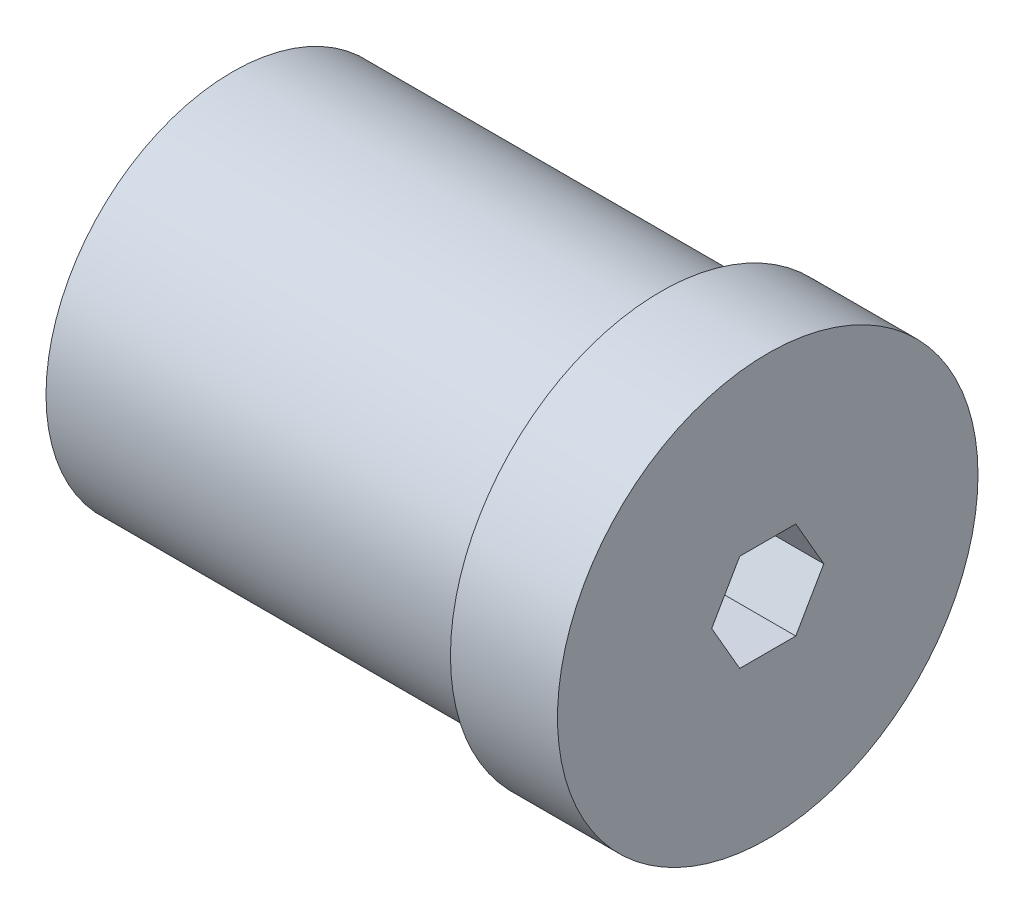
ISO-10303-21;
HEADER;
FILE_DESCRIPTION(('STEP AP214'),'2;1');
FILE_NAME('part.step','',(''),(''),'','','');
FILE_SCHEMA(('AUTOMOTIVE_DESIGN { 1 0 10303 214 1 1 1 1 }'));
ENDSEC;
DATA;
#1=APPLICATION_CONTEXT('core data for automotive mechanical design processes');
#2=APPLICATION_PROTOCOL_DEFINITION('international standard','automotive_design',2000,#1);
#3=PRODUCT_CONTEXT('',#1,'mechanical');
#4=PRODUCT('Part','Part','',(#3));
#5=PRODUCT_RELATED_PRODUCT_CATEGORY('part','',(#4));
#6=PRODUCT_DEFINITION_FORMATION('','',#4);
#7=PRODUCT_DEFINITION_CONTEXT('part definition',#1,'design');
#8=PRODUCT_DEFINITION('design','',#6,#7);
#9=PRODUCT_DEFINITION_SHAPE('','',#8);
#10=(LENGTH_UNIT() NAMED_UNIT(*) SI_UNIT(.MILLI.,.METRE.));
#11=(NAMED_UNIT(*) PLANE_ANGLE_UNIT() SI_UNIT($,.RADIAN.));
#12=(NAMED_UNIT(*) SI_UNIT($,.STERADIAN.) SOLID_ANGLE_UNIT());
#13=UNCERTAINTY_MEASURE_WITH_UNIT(LENGTH_MEASURE(1.E-05),#10,'distance_accuracy_value','');
#14=(GEOMETRIC_REPRESENTATION_CONTEXT(3) GLOBAL_UNCERTAINTY_ASSIGNED_CONTEXT((#13)) GLOBAL_UNIT_ASSIGNED_CONTEXT((#10,
#11,#12)) REPRESENTATION_CONTEXT('',''));
#15=CARTESIAN_POINT('',(0.,0.,0.));
#16=DIRECTION('',(0.,0.,1.));
#17=DIRECTION('',(1.,0.,0.));
#18=AXIS2_PLACEMENT_3D('',#15,#16,#17);
#19=CARTESIAN_POINT('',(66.,0.,0.));
#20=DIRECTION('',(1.,0.,0.));
#21=DIRECTION('',(0.,0.,-1.));
#22=AXIS2_PLACEMENT_3D('',#19,#20,#21);
#23=PLANE('',#22);
#24=CARTESIAN_POINT('',(66.,0.,0.));
#25=DIRECTION('',(1.,0.,0.));
#26=DIRECTION('',(0.,0.,-1.));
#27=AXIS2_PLACEMENT_3D('',#24,#25,#26);
#28=CIRCLE('',#27,24.4);
#29=CARTESIAN_POINT('',(66.,0.,-24.4));
#30=VERTEX_POINT('',#29);
#31=EDGE_CURVE('E11',#30,#30,#28,.T.);
#32=ORIENTED_EDGE('',*,*,#31,.T.);
#33=EDGE_LOOP('',(#32));
#34=FACE_BOUND('',#33,.T.);
#35=CARTESIAN_POINT('',(66.,0.,0.));
#36=DIRECTION('',(-1.,0.,0.));
#37=DIRECTION('',(0.,0.,1.));
#38=AXIS2_PLACEMENT_3D('',#35,#36,#37);
#39=CIRCLE('',#38,25.4);
#40=CARTESIAN_POINT('',(66.,0.,25.4));
#41=VERTEX_POINT('',#40);
#42=EDGE_CURVE('E285',#41,#41,#39,.T.);
#43=ORIENTED_EDGE('',*,*,#42,.T.);
#44=EDGE_LOOP('',(#43));
#45=FACE_BOUND('',#44,.T.);
#46=ADVANCED_FACE('F37',(#34,#45),#23,.F.);
#47=CARTESIAN_POINT('',(70.,0.,0.));
#48=DIRECTION('',(-1.,0.,0.));
#49=DIRECTION('',(0.,0.,1.));
#50=AXIS2_PLACEMENT_3D('',#47,#48,#49);
#51=CYLINDRICAL_SURFACE('',#50,24.4);
#52=CARTESIAN_POINT('',(0.,0.,0.));
#53=DIRECTION('',(1.,0.,0.));
#54=DIRECTION('',(0.,0.,-1.));
#55=AXIS2_PLACEMENT_3D('',#52,#53,#54);
#56=CIRCLE('',#55,24.4);
#57=CARTESIAN_POINT('',(0.,0.,-24.4));
#58=VERTEX_POINT('',#57);
#59=EDGE_CURVE('E45',#58,#58,#56,.T.);
#60=ORIENTED_EDGE('',*,*,#59,.T.);
#61=EDGE_LOOP('',(#60));
#62=FACE_BOUND('',#61,.T.);
#63=ORIENTED_EDGE('',*,*,#31,.F.);
#64=EDGE_LOOP('',(#63));
#65=FACE_BOUND('',#64,.T.);
#66=ADVANCED_FACE('F39',(#62,#65),#51,.T.);
#67=CARTESIAN_POINT('',(70.,0.,0.));
#68=DIRECTION('',(1.,0.,0.));
#69=DIRECTION('',(0.,0.,-1.));
#70=AXIS2_PLACEMENT_3D('',#67,#68,#69);
#71=PLANE('',#70);
#72=DIRECTION('',(0.,0.866025403784439,0.5));
#73=VECTOR('',#72,1.);
#74=CARTESIAN_POINT('',(70.,0.,-7.33234841870825));
#75=LINE('',#74,#73);
#76=CARTESIAN_POINT('',(70.,0.,-7.33234841870825));
#77=VERTEX_POINT('',#76);
#78=CARTESIAN_POINT('',(70.,6.35,-3.66617420935412));
#79=VERTEX_POINT('',#78);
#80=EDGE_CURVE('E98',#77,#79,#75,.T.);
#81=ORIENTED_EDGE('',*,*,#80,.F.);
#82=DIRECTION('',(0.,0.866025403784439,-0.5));
#83=VECTOR('',#82,1.);
#84=CARTESIAN_POINT('',(70.,-6.35,-3.66617420935412));
#85=LINE('',#84,#83);
#86=CARTESIAN_POINT('',(70.,-6.35,-3.66617420935412));
#87=VERTEX_POINT('',#86);
#88=EDGE_CURVE('E90',#87,#77,#85,.T.);
#89=ORIENTED_EDGE('',*,*,#88,.F.);
#90=DIRECTION('',(0.,0.,-1.));
#91=VECTOR('',#90,1.);
#92=CARTESIAN_POINT('',(70.,-6.35,3.66617420935413));
#93=LINE('',#92,#91);
#94=CARTESIAN_POINT('',(70.,-6.35,3.66617420935413));
#95=VERTEX_POINT('',#94);
#96=EDGE_CURVE('E121',#95,#87,#93,.T.);
#97=ORIENTED_EDGE('',*,*,#96,.F.);
#98=DIRECTION('',(0.,-0.866025403784439,-0.5));
#99=VECTOR('',#98,1.);
#100=CARTESIAN_POINT('',(70.,0.,7.33234841870825));
#101=LINE('',#100,#99);
#102=CARTESIAN_POINT('',(70.,0.,7.33234841870825));
#103=VERTEX_POINT('',#102);
#104=EDGE_CURVE('E119',#103,#95,#101,.T.);
#105=ORIENTED_EDGE('',*,*,#104,.F.);
#106=DIRECTION('',(0.,-0.866025403784439,0.5));
#107=VECTOR('',#106,1.);
#108=CARTESIAN_POINT('',(70.,6.35,3.66617420935412));
#109=LINE('',#108,#107);
#110=CARTESIAN_POINT('',(70.,6.35,3.66617420935412));
#111=VERTEX_POINT('',#110);
#112=EDGE_CURVE('E114',#111,#103,#109,.T.);
#113=ORIENTED_EDGE('',*,*,#112,.F.);
#114=DIRECTION('',(0.,0.,1.));
#115=VECTOR('',#114,1.);
#116=CARTESIAN_POINT('',(70.,6.35,-3.66617420935412));
#117=LINE('',#116,#115);
#118=EDGE_CURVE('E112',#79,#111,#117,.T.);
#119=ORIENTED_EDGE('',*,*,#118,.F.);
#120=EDGE_LOOP('',(#81,#89,#97,#105,#113,#119));
#121=FACE_BOUND('',#120,.T.);
#122=CARTESIAN_POINT('',(70.,0.,0.));
#123=DIRECTION('',(1.,0.,0.));
#124=DIRECTION('',(0.,0.,-1.));
#125=AXIS2_PLACEMENT_3D('',#122,#123,#124);
#126=CIRCLE('',#125,27.5);
#127=CARTESIAN_POINT('',(70.,0.,-27.5));
#128=VERTEX_POINT('',#127);
#129=EDGE_CURVE('E124',#128,#128,#126,.T.);
#130=ORIENTED_EDGE('',*,*,#129,.T.);
#131=EDGE_LOOP('',(#130));
#132=FACE_BOUND('',#131,.T.);
#133=ADVANCED_FACE('F109',(#121,#132),#71,.T.);
#134=CARTESIAN_POINT('',(0.,0.,0.));
#135=DIRECTION('',(1.,0.,0.));
#136=DIRECTION('',(0.,0.,-1.));
#137=AXIS2_PLACEMENT_3D('',#134,#135,#136);
#138=PLANE('',#137);
#139=ORIENTED_EDGE('',*,*,#59,.F.);
#140=EDGE_LOOP('',(#139));
#141=FACE_BOUND('',#140,.T.);
#142=DIRECTION('',(0.,0.866025403784439,-0.5));
#143=VECTOR('',#142,1.);
#144=CARTESIAN_POINT('',(0.,-6.35,-3.66617420935412));
#145=LINE('',#144,#143);
#146=CARTESIAN_POINT('',(0.,-6.35,-3.66617420935412));
#147=VERTEX_POINT('',#146);
#148=CARTESIAN_POINT('',(0.,0.,-7.33234841870825));
#149=VERTEX_POINT('',#148);
#150=EDGE_CURVE('E60',#147,#149,#145,.T.);
#151=ORIENTED_EDGE('',*,*,#150,.T.);
#152=DIRECTION('',(0.,0.866025403784439,0.5));
#153=VECTOR('',#152,1.);
#154=CARTESIAN_POINT('',(0.,0.,-7.33234841870825));
#155=LINE('',#154,#153);
#156=CARTESIAN_POINT('',(0.,6.35,-3.66617420935412));
#157=VERTEX_POINT('',#156);
#158=EDGE_CURVE('E105',#149,#157,#155,.T.);
#159=ORIENTED_EDGE('',*,*,#158,.T.);
#160=DIRECTION('',(0.,0.,1.));
#161=VECTOR('',#160,1.);
#162=CARTESIAN_POINT('',(0.,6.35,-3.66617420935412));
#163=LINE('',#162,#161);
#164=CARTESIAN_POINT('',(0.,6.35,3.66617420935412));
#165=VERTEX_POINT('',#164);
#166=EDGE_CURVE('E126',#157,#165,#163,.T.);
#167=ORIENTED_EDGE('',*,*,#166,.T.);
#168=DIRECTION('',(0.,-0.866025403784439,0.5));
#169=VECTOR('',#168,1.);
#170=CARTESIAN_POINT('',(0.,6.35,3.66617420935412));
#171=LINE('',#170,#169);
#172=CARTESIAN_POINT('',(0.,0.,7.33234841870825));
#173=VERTEX_POINT('',#172);
#174=EDGE_CURVE('E129',#165,#173,#171,.T.);
#175=ORIENTED_EDGE('',*,*,#174,.T.);
#176=DIRECTION('',(0.,-0.866025403784439,-0.5));
#177=VECTOR('',#176,1.);
#178=CARTESIAN_POINT('',(0.,0.,7.33234841870825));
#179=LINE('',#178,#177);
#180=CARTESIAN_POINT('',(0.,-6.35,3.66617420935413));
#181=VERTEX_POINT('',#180);
#182=EDGE_CURVE('E132',#173,#181,#179,.T.);
#183=ORIENTED_EDGE('',*,*,#182,.T.);
#184=DIRECTION('',(0.,0.,-1.));
#185=VECTOR('',#184,1.);
#186=CARTESIAN_POINT('',(0.,-6.35,3.66617420935413));
#187=LINE('',#186,#185);
#188=EDGE_CURVE('E99',#181,#147,#187,.T.);
#189=ORIENTED_EDGE('',*,*,#188,.T.);
#190=EDGE_LOOP('',(#151,#159,#167,#175,#183,#189));
#191=FACE_BOUND('',#190,.T.);
#192=ADVANCED_FACE('F148',(#141,#191),#138,.F.);
#193=CARTESIAN_POINT('',(70.,-6.35,-3.66617420935412));
#194=DIRECTION('',(0.,0.5,0.866025403784439));
#195=DIRECTION('',(0.,-0.866025403784439,0.5));
#196=AXIS2_PLACEMENT_3D('',#193,#194,#195);
#197=PLANE('',#196);
#198=ORIENTED_EDGE('',*,*,#150,.F.);
#199=DIRECTION('',(-1.,0.,0.));
#200=VECTOR('',#199,1.);
#201=CARTESIAN_POINT('',(70.,-6.35,-3.66617420935412));
#202=LINE('',#201,#200);
#203=EDGE_CURVE('E94',#87,#147,#202,.T.);
#204=ORIENTED_EDGE('',*,*,#203,.F.);
#205=ORIENTED_EDGE('',*,*,#88,.T.);
#206=DIRECTION('',(-1.,0.,0.));
#207=VECTOR('',#206,1.);
#208=CARTESIAN_POINT('',(70.,0.,-7.33234841870825));
#209=LINE('',#208,#207);
#210=EDGE_CURVE('E93',#77,#149,#209,.T.);
#211=ORIENTED_EDGE('',*,*,#210,.T.);
#212=EDGE_LOOP('',(#198,#204,#205,#211));
#213=FACE_BOUND('',#212,.T.);
#214=ADVANCED_FACE('F92',(#213),#197,.T.);
#215=CARTESIAN_POINT('',(70.,0.,-7.33234841870825));
#216=DIRECTION('',(0.,-0.5,0.866025403784439));
#217=DIRECTION('',(0.,-0.866025403784439,-0.5));
#218=AXIS2_PLACEMENT_3D('',#215,#216,#217);
#219=PLANE('',#218);
#220=ORIENTED_EDGE('',*,*,#158,.F.);
#221=ORIENTED_EDGE('',*,*,#210,.F.);
#222=ORIENTED_EDGE('',*,*,#80,.T.);
#223=DIRECTION('',(-1.,0.,0.));
#224=VECTOR('',#223,1.);
#225=CARTESIAN_POINT('',(70.,6.35,-3.66617420935412));
#226=LINE('',#225,#224);
#227=EDGE_CURVE('E106',#79,#157,#226,.T.);
#228=ORIENTED_EDGE('',*,*,#227,.T.);
#229=EDGE_LOOP('',(#220,#221,#222,#228));
#230=FACE_BOUND('',#229,.T.);
#231=ADVANCED_FACE('F102',(#230),#219,.T.);
#232=CARTESIAN_POINT('',(70.,6.35,-3.66617420935412));
#233=DIRECTION('',(0.,-1.,0.));
#234=DIRECTION('',(0.,0.,-1.));
#235=AXIS2_PLACEMENT_3D('',#232,#233,#234);
#236=PLANE('',#235);
#237=ORIENTED_EDGE('',*,*,#166,.F.);
#238=ORIENTED_EDGE('',*,*,#227,.F.);
#239=ORIENTED_EDGE('',*,*,#118,.T.);
#240=DIRECTION('',(-1.,0.,0.));
#241=VECTOR('',#240,1.);
#242=CARTESIAN_POINT('',(70.,6.35,3.66617420935412));
#243=LINE('',#242,#241);
#244=EDGE_CURVE('E141',#111,#165,#243,.T.);
#245=ORIENTED_EDGE('',*,*,#244,.T.);
#246=EDGE_LOOP('',(#237,#238,#239,#245));
#247=FACE_BOUND('',#246,.T.);
#248=ADVANCED_FACE('F163',(#247),#236,.T.);
#249=CARTESIAN_POINT('',(70.,6.35,3.66617420935412));
#250=DIRECTION('',(0.,-0.5,-0.866025403784439));
#251=DIRECTION('',(0.,0.866025403784439,-0.5));
#252=AXIS2_PLACEMENT_3D('',#249,#250,#251);
#253=PLANE('',#252);
#254=ORIENTED_EDGE('',*,*,#174,.F.);
#255=ORIENTED_EDGE('',*,*,#244,.F.);
#256=ORIENTED_EDGE('',*,*,#112,.T.);
#257=DIRECTION('',(-1.,0.,0.));
#258=VECTOR('',#257,1.);
#259=CARTESIAN_POINT('',(70.,0.,7.33234841870825));
#260=LINE('',#259,#258);
#261=EDGE_CURVE('E139',#103,#173,#260,.T.);
#262=ORIENTED_EDGE('',*,*,#261,.T.);
#263=EDGE_LOOP('',(#254,#255,#256,#262));
#264=FACE_BOUND('',#263,.T.);
#265=ADVANCED_FACE('F159',(#264),#253,.T.);
#266=CARTESIAN_POINT('',(70.,0.,7.33234841870825));
#267=DIRECTION('',(0.,0.5,-0.866025403784439));
#268=DIRECTION('',(0.,0.866025403784439,0.5));
#269=AXIS2_PLACEMENT_3D('',#266,#267,#268);
#270=PLANE('',#269);
#271=ORIENTED_EDGE('',*,*,#182,.F.);
#272=ORIENTED_EDGE('',*,*,#261,.F.);
#273=ORIENTED_EDGE('',*,*,#104,.T.);
#274=DIRECTION('',(-1.,0.,0.));
#275=VECTOR('',#274,1.);
#276=CARTESIAN_POINT('',(70.,-6.35,3.66617420935413));
#277=LINE('',#276,#275);
#278=EDGE_CURVE('E52',#95,#181,#277,.T.);
#279=ORIENTED_EDGE('',*,*,#278,.T.);
#280=EDGE_LOOP('',(#271,#272,#273,#279));
#281=FACE_BOUND('',#280,.T.);
#282=ADVANCED_FACE('F156',(#281),#270,.T.);
#283=CARTESIAN_POINT('',(70.,-6.35,3.66617420935413));
#284=DIRECTION('',(0.,1.,0.));
#285=DIRECTION('',(0.,0.,1.));
#286=AXIS2_PLACEMENT_3D('',#283,#284,#285);
#287=PLANE('',#286);
#288=ORIENTED_EDGE('',*,*,#188,.F.);
#289=ORIENTED_EDGE('',*,*,#278,.F.);
#290=ORIENTED_EDGE('',*,*,#96,.T.);
#291=ORIENTED_EDGE('',*,*,#203,.T.);
#292=EDGE_LOOP('',(#288,#289,#290,#291));
#293=FACE_BOUND('',#292,.T.);
#294=ADVANCED_FACE('F152',(#293),#287,.T.);
#295=CARTESIAN_POINT('',(66.,0.,0.));
#296=DIRECTION('',(1.,0.,0.));
#297=DIRECTION('',(0.,0.,-1.));
#298=AXIS2_PLACEMENT_3D('',#295,#296,#297);
#299=CYLINDRICAL_SURFACE('',#298,27.5);
#300=ORIENTED_EDGE('',*,*,#129,.F.);
#301=EDGE_LOOP('',(#300));
#302=FACE_BOUND('',#301,.T.);
#303=CARTESIAN_POINT('',(56.,0.,0.));
#304=DIRECTION('',(-1.,0.,0.));
#305=DIRECTION('',(0.,0.,1.));
#306=AXIS2_PLACEMENT_3D('',#303,#304,#305);
#307=CIRCLE('',#306,27.5);
#308=CARTESIAN_POINT('',(56.,0.,27.5));
#309=VERTEX_POINT('',#308);
#310=EDGE_CURVE('E287',#309,#309,#307,.T.);
#311=ORIENTED_EDGE('',*,*,#310,.F.);
#312=EDGE_LOOP('',(#311));
#313=FACE_BOUND('',#312,.T.);
#314=ADVANCED_FACE('F183',(#302,#313),#299,.T.);
#315=CARTESIAN_POINT('',(56.,0.,0.));
#316=DIRECTION('',(-1.,0.,0.));
#317=DIRECTION('',(0.,0.,1.));
#318=AXIS2_PLACEMENT_3D('',#315,#316,#317);
#319=PLANE('',#318);
#320=ORIENTED_EDGE('',*,*,#310,.T.);
#321=EDGE_LOOP('',(#320));
#322=FACE_BOUND('',#321,.T.);
#323=CARTESIAN_POINT('',(56.,0.,0.));
#324=DIRECTION('',(-1.,0.,0.));
#325=DIRECTION('',(0.,0.,1.));
#326=AXIS2_PLACEMENT_3D('',#323,#324,#325);
#327=CIRCLE('',#326,25.4);
#328=CARTESIAN_POINT('',(56.,0.,25.4));
#329=VERTEX_POINT('',#328);
#330=EDGE_CURVE('E282',#329,#329,#327,.T.);
#331=ORIENTED_EDGE('',*,*,#330,.F.);
#332=EDGE_LOOP('',(#331));
#333=FACE_BOUND('',#332,.T.);
#334=ADVANCED_FACE('F181',(#322,#333),#319,.T.);
#335=CARTESIAN_POINT('',(56.,0.,0.));
#336=DIRECTION('',(1.,0.,0.));
#337=DIRECTION('',(0.,0.,-1.));
#338=AXIS2_PLACEMENT_3D('',#335,#336,#337);
#339=CYLINDRICAL_SURFACE('',#338,25.4);
#340=ORIENTED_EDGE('',*,*,#330,.T.);
#341=EDGE_LOOP('',(#340));
#342=FACE_BOUND('',#341,.T.);
#343=ORIENTED_EDGE('',*,*,#42,.F.);
#344=EDGE_LOOP('',(#343));
#345=FACE_BOUND('',#344,.T.);
#346=ADVANCED_FACE('F209',(#342,#345),#339,.F.);
#347=CLOSED_SHELL('',(#46,#66,#133,#192,#214,#231,#248,#265,#282,#294,#314,#334,#346));
#348=MANIFOLD_SOLID_BREP('B2',#347);
#349=ADVANCED_BREP_SHAPE_REPRESENTATION('',(#18,#348),#14);
#350=SHAPE_DEFINITION_REPRESENTATION(#9,#349);
ENDSEC;
END-ISO-10303-21;
